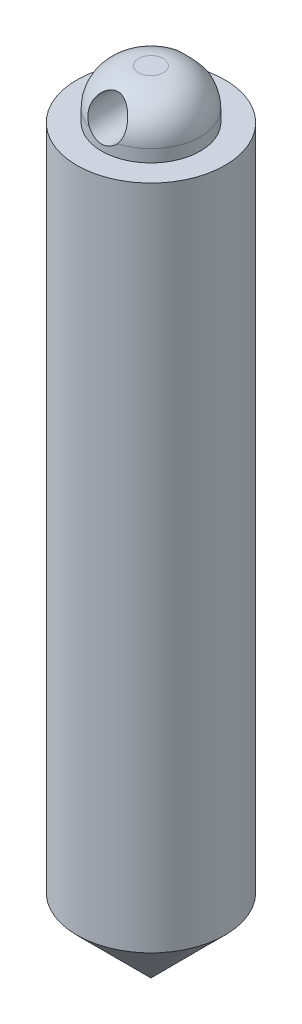
ISO-10303-21;
HEADER;
FILE_DESCRIPTION(('STEP AP214'),'2;1');
FILE_NAME('part.step','',(''),(''),'','','');
FILE_SCHEMA(('AUTOMOTIVE_DESIGN { 1 0 10303 214 1 1 1 1 }'));
ENDSEC;
DATA;
#1=APPLICATION_CONTEXT('core data for automotive mechanical design processes');
#2=APPLICATION_PROTOCOL_DEFINITION('international standard','automotive_design',2000,#1);
#3=PRODUCT_CONTEXT('',#1,'mechanical');
#4=PRODUCT('Part','Part','',(#3));
#5=PRODUCT_RELATED_PRODUCT_CATEGORY('part','',(#4));
#6=PRODUCT_DEFINITION_FORMATION('','',#4);
#7=PRODUCT_DEFINITION_CONTEXT('part definition',#1,'design');
#8=PRODUCT_DEFINITION('design','',#6,#7);
#9=PRODUCT_DEFINITION_SHAPE('','',#8);
#10=(LENGTH_UNIT() NAMED_UNIT(*) SI_UNIT(.MILLI.,.METRE.));
#11=(NAMED_UNIT(*) PLANE_ANGLE_UNIT() SI_UNIT($,.RADIAN.));
#12=(NAMED_UNIT(*) SI_UNIT($,.STERADIAN.) SOLID_ANGLE_UNIT());
#13=UNCERTAINTY_MEASURE_WITH_UNIT(LENGTH_MEASURE(1.E-05),#10,'distance_accuracy_value','');
#14=(GEOMETRIC_REPRESENTATION_CONTEXT(3) GLOBAL_UNCERTAINTY_ASSIGNED_CONTEXT((#13)) GLOBAL_UNIT_ASSIGNED_CONTEXT((#10,
#11,#12)) REPRESENTATION_CONTEXT('',''));
#15=CARTESIAN_POINT('',(0.,0.,0.));
#16=DIRECTION('',(0.,0.,1.));
#17=DIRECTION('',(1.,0.,0.));
#18=AXIS2_PLACEMENT_3D('',#15,#16,#17);
#19=CARTESIAN_POINT('',(0.,35.,0.));
#20=DIRECTION('',(0.,-1.,0.));
#21=DIRECTION('',(0.,0.,-1.));
#22=AXIS2_PLACEMENT_3D('',#19,#20,#21);
#23=CYLINDRICAL_SURFACE('',#22,28.6427964339937);
#24=CARTESIAN_POINT('',(0.,35.,0.));
#25=DIRECTION('',(0.,-1.,0.));
#26=DIRECTION('',(0.,0.,-1.));
#27=AXIS2_PLACEMENT_3D('',#24,#25,#26);
#28=CIRCLE('',#27,28.6427964339937);
#29=CARTESIAN_POINT('',(0.,35.,-28.6427964339937));
#30=VERTEX_POINT('',#29);
#31=EDGE_CURVE('E60',#30,#30,#28,.T.);
#32=ORIENTED_EDGE('',*,*,#31,.F.);
#33=EDGE_LOOP('',(#32));
#34=FACE_BOUND('',#33,.T.);
#35=CARTESIAN_POINT('',(0.,50.,0.));
#36=DIRECTION('',(0.,-1.,0.));
#37=DIRECTION('',(0.,0.,-1.));
#38=AXIS2_PLACEMENT_3D('',#35,#36,#37);
#39=CIRCLE('',#38,28.6427964339937);
#40=CARTESIAN_POINT('',(0.,50.,-28.6427964339937));
#41=VERTEX_POINT('',#40);
#42=EDGE_CURVE('E11',#41,#41,#39,.T.);
#43=ORIENTED_EDGE('',*,*,#42,.T.);
#44=EDGE_LOOP('',(#43));
#45=FACE_BOUND('',#44,.T.);
#46=ADVANCED_FACE('F46',(#34,#45),#23,.T.);
#47=CARTESIAN_POINT('',(-28.6427964339937,50.,0.));
#48=DIRECTION('',(0.,-1.,0.));
#49=DIRECTION('',(0.,0.,-1.));
#50=AXIS2_PLACEMENT_3D('',#47,#48,#49);
#51=PLANE('',#50);
#52=ORIENTED_EDGE('',*,*,#42,.F.);
#53=EDGE_LOOP('',(#52));
#54=FACE_BOUND('',#53,.T.);
#55=CARTESIAN_POINT('',(0.,50.,0.));
#56=DIRECTION('',(0.,-1.,0.));
#57=DIRECTION('',(0.,0.,-1.));
#58=AXIS2_PLACEMENT_3D('',#55,#56,#57);
#59=CIRCLE('',#58,18.6427964339937);
#60=CARTESIAN_POINT('',(0.,50.,-18.6427964339937));
#61=VERTEX_POINT('',#60);
#62=EDGE_CURVE('E52',#61,#61,#59,.T.);
#63=ORIENTED_EDGE('',*,*,#62,.T.);
#64=EDGE_LOOP('',(#63));
#65=FACE_BOUND('',#64,.T.);
#66=ADVANCED_FACE('F69',(#54,#65),#51,.F.);
#67=CARTESIAN_POINT('',(0.,35.,0.));
#68=DIRECTION('',(0.,-1.,0.));
#69=DIRECTION('',(0.,0.,-1.));
#70=AXIS2_PLACEMENT_3D('',#67,#68,#69);
#71=CYLINDRICAL_SURFACE('',#70,18.6427964339937);
#72=ORIENTED_EDGE('',*,*,#62,.F.);
#73=EDGE_LOOP('',(#72));
#74=FACE_BOUND('',#73,.T.);
#75=CARTESIAN_POINT('',(0.,35.,0.));
#76=DIRECTION('',(0.,-1.,0.));
#77=DIRECTION('',(0.,0.,-1.));
#78=AXIS2_PLACEMENT_3D('',#75,#76,#77);
#79=CIRCLE('',#78,18.6427964339937);
#80=CARTESIAN_POINT('',(0.,35.,-18.6427964339937));
#81=VERTEX_POINT('',#80);
#82=EDGE_CURVE('E56',#81,#81,#79,.T.);
#83=ORIENTED_EDGE('',*,*,#82,.T.);
#84=EDGE_LOOP('',(#83));
#85=FACE_BOUND('',#84,.T.);
#86=ADVANCED_FACE('F73',(#74,#85),#71,.F.);
#87=CARTESIAN_POINT('',(-28.6427964339937,35.,0.));
#88=DIRECTION('',(0.,1.,0.));
#89=DIRECTION('',(0.,0.,1.));
#90=AXIS2_PLACEMENT_3D('',#87,#88,#89);
#91=PLANE('',#90);
#92=ORIENTED_EDGE('',*,*,#82,.F.);
#93=EDGE_LOOP('',(#92));
#94=FACE_BOUND('',#93,.T.);
#95=ORIENTED_EDGE('',*,*,#31,.T.);
#96=EDGE_LOOP('',(#95));
#97=FACE_BOUND('',#96,.T.);
#98=ADVANCED_FACE('F66',(#94,#97),#91,.F.);
#99=CLOSED_SHELL('',(#46,#66,#86,#98));
#100=MANIFOLD_SOLID_BREP('B2',#99);
#101=CARTESIAN_POINT('',(0.,270.,0.));
#102=DIRECTION('',(0.,-1.,0.));
#103=DIRECTION('',(0.,0.,-1.));
#104=AXIS2_PLACEMENT_3D('',#101,#102,#103);
#105=CYLINDRICAL_SURFACE('',#104,30.);
#106=CARTESIAN_POINT('',(0.,270.,0.));
#107=DIRECTION('',(0.,1.,0.));
#108=DIRECTION('',(0.,0.,1.));
#109=AXIS2_PLACEMENT_3D('',#106,#107,#108);
#110=CIRCLE('',#109,30.);
#111=CARTESIAN_POINT('',(0.,270.,30.));
#112=VERTEX_POINT('',#111);
#113=EDGE_CURVE('E215',#112,#112,#110,.T.);
#114=ORIENTED_EDGE('',*,*,#113,.F.);
#115=EDGE_LOOP('',(#114));
#116=FACE_BOUND('',#115,.T.);
#117=CARTESIAN_POINT('',(0.,0.,0.));
#118=DIRECTION('',(0.,1.,0.));
#119=DIRECTION('',(0.,0.,1.));
#120=AXIS2_PLACEMENT_3D('',#117,#118,#119);
#121=CIRCLE('',#120,30.);
#122=CARTESIAN_POINT('',(0.,0.,30.));
#123=VERTEX_POINT('',#122);
#124=EDGE_CURVE('E218',#123,#123,#121,.T.);
#125=ORIENTED_EDGE('',*,*,#124,.T.);
#126=EDGE_LOOP('',(#125));
#127=FACE_BOUND('',#126,.T.);
#128=ADVANCED_FACE('F108',(#116,#127),#105,.T.);
#129=CARTESIAN_POINT('',(0.,270.,0.));
#130=DIRECTION('',(0.,1.,0.));
#131=DIRECTION('',(0.,0.,1.));
#132=AXIS2_PLACEMENT_3D('',#129,#130,#131);
#133=PLANE('',#132);
#134=CARTESIAN_POINT('',(0.,270.,0.));
#135=DIRECTION('',(0.,1.,0.));
#136=DIRECTION('',(0.,0.,1.));
#137=AXIS2_PLACEMENT_3D('',#134,#135,#136);
#138=CIRCLE('',#137,20.);
#139=CARTESIAN_POINT('',(0.,270.,20.));
#140=VERTEX_POINT('',#139);
#141=EDGE_CURVE('E159',#140,#140,#138,.T.);
#142=ORIENTED_EDGE('',*,*,#141,.F.);
#143=EDGE_LOOP('',(#142));
#144=FACE_BOUND('',#143,.T.);
#145=ORIENTED_EDGE('',*,*,#113,.T.);
#146=EDGE_LOOP('',(#145));
#147=FACE_BOUND('',#146,.T.);
#148=ADVANCED_FACE('F191',(#144,#147),#133,.T.);
#149=CARTESIAN_POINT('',(0.,-30.,0.));
#150=DIRECTION('',(0.,1.,0.));
#151=DIRECTION('',(0.,0.,1.));
#152=AXIS2_PLACEMENT_3D('',#149,#150,#151);
#153=CONICAL_SURFACE('',#152,0.,0.785398163397448);
#154=ORIENTED_EDGE('',*,*,#124,.F.);
#155=EDGE_LOOP('',(#154));
#156=FACE_BOUND('',#155,.T.);
#157=CARTESIAN_POINT('',(0.,-30.,0.));
#158=VERTEX_POINT('',#157);
#159=VERTEX_LOOP('',#158);
#160=FACE_BOUND('',#159,.T.);
#161=ADVANCED_FACE('F187',(#156,#160),#153,.T.);
#162=CARTESIAN_POINT('',(0.,290.,0.));
#163=DIRECTION('',(0.,-1.,0.));
#164=DIRECTION('',(0.,0.,-1.));
#165=AXIS2_PLACEMENT_3D('',#162,#163,#164);
#166=CYLINDRICAL_SURFACE('',#165,20.);
#167=CARTESIAN_POINT('',(0.,275.,0.));
#168=DIRECTION('',(0.,1.,0.));
#169=DIRECTION('',(0.,0.,1.));
#170=AXIS2_PLACEMENT_3D('',#167,#168,#169);
#171=CIRCLE('',#170,20.);
#172=CARTESIAN_POINT('',(5.59016994374949,275.,-19.2028643696715));
#173=VERTEX_POINT('',#172);
#174=CARTESIAN_POINT('',(5.59016994374949,275.,19.2028643696715));
#175=VERTEX_POINT('',#174);
#176=EDGE_CURVE('E153',#173,#175,#171,.F.);
#177=ORIENTED_EDGE('',*,*,#176,.T.);
#178=CARTESIAN_POINT('',(5.59016994374949,275.,19.2028643696715));
#179=CARTESIAN_POINT('',(5.45032258890132,274.843631157481,19.243583425374));
#180=CARTESIAN_POINT('',(5.30392897479388,274.69317496289,19.2845359120735));
#181=CARTESIAN_POINT('',(4.99894296702762,274.404952274119,19.3658305769389));
#182=CARTESIAN_POINT('',(4.8403487561464,274.267187677036,19.4061726631133));
#183=CARTESIAN_POINT('',(4.51157094539349,274.004999308431,19.485235103552));
#184=CARTESIAN_POINT('',(4.34136492225987,273.880602616046,19.5239520726932));
#185=CARTESIAN_POINT('',(3.9906696200309,273.646338401218,19.5986398709426));
#186=CARTESIAN_POINT('',(3.81018092001957,273.536470061745,19.6346108544286));
#187=CARTESIAN_POINT('',(3.43970171290755,273.331919148331,19.7028929034449));
#188=CARTESIAN_POINT('',(3.24969516775314,273.237263420374,19.7351974699021));
#189=CARTESIAN_POINT('',(2.86172949951137,273.064178679726,19.7951767825535));
#190=CARTESIAN_POINT('',(2.66377080840725,272.98574878702,19.8228517798185));
#191=CARTESIAN_POINT('',(2.26151625113917,272.845922184914,19.8727594064096));
#192=CARTESIAN_POINT('',(2.05722807183664,272.784505650629,19.8949983665139));
#193=CARTESIAN_POINT('',(1.64362602624192,272.679206001055,19.9334296585282));
#194=CARTESIAN_POINT('',(1.43431241452904,272.635321999576,19.949622296049));
#195=CARTESIAN_POINT('',(1.02105443234143,272.567000755216,19.9749472048522));
#196=CARTESIAN_POINT('',(0.817246801690964,272.541833273531,19.9843441514046));
#197=CARTESIAN_POINT('',(0.408062954148355,272.508296626618,19.996884143916));
#198=CARTESIAN_POINT('',(0.202686776257213,272.499927045077,20.0000273448657));
#199=CARTESIAN_POINT('',(-0.208066873170677,272.500073919764,19.9999722933196));
#200=CARTESIAN_POINT('',(-0.413444344336916,272.508591148379,19.9967737507582));
#201=CARTESIAN_POINT('',(-0.822613097652393,272.542423534879,19.9841237129078));
#202=CARTESIAN_POINT('',(-1.0264044073933,272.5677383999,19.9746723266355));
#203=CARTESIAN_POINT('',(-1.42340402614205,272.633663849929,19.9502383642098));
#204=CARTESIAN_POINT('',(-1.61672550991742,272.673676118245,19.9354725532663));
#205=CARTESIAN_POINT('',(-1.99923967619587,272.768686855877,19.9007521144654));
#206=CARTESIAN_POINT('',(-2.18843095922711,272.823690322208,19.8807957565453));
#207=CARTESIAN_POINT('',(-2.56146696263992,272.948222324256,19.8361838584658));
#208=CARTESIAN_POINT('',(-2.74530984192054,273.01775579584,19.8115267216942));
#209=CARTESIAN_POINT('',(-3.10647914654353,273.170779197329,19.7581152483328));
#210=CARTESIAN_POINT('',(-3.28380522781653,273.254269862848,19.7293606958003));
#211=CARTESIAN_POINT('',(-3.63651669670947,273.437492682309,19.6674561392738));
#212=CARTESIAN_POINT('',(-3.8116557314352,273.537661248795,19.6341944148924));
#213=CARTESIAN_POINT('',(-4.15285523414972,273.751455025764,19.5648689040141));
#214=CARTESIAN_POINT('',(-4.31891826671761,273.865076405891,19.5288059161088));
#215=CARTESIAN_POINT('',(-4.64085506275789,274.104858674597,19.454811951969));
#216=CARTESIAN_POINT('',(-4.7967445087303,274.230999469758,19.4168840167766));
#217=CARTESIAN_POINT('',(-5.09773973798763,274.495173251621,19.3400402871739));
#218=CARTESIAN_POINT('',(-5.24284994848067,274.633201305168,19.3011249072328));
#219=CARTESIAN_POINT('',(-5.45302575746426,274.849770015048,19.2423994447944));
#220=CARTESIAN_POINT('',(-5.52237082059306,274.924195410621,19.2226023893761));
#221=CARTESIAN_POINT('',(-5.59016994374949,275.,19.2028643696715));
#222=B_SPLINE_CURVE_WITH_KNOTS('',3,(#178,#179,#180,#181,#182,#183,#184,#185,#186,#187,#188,
#189,#190,#191,#192,#193,#194,#195,#196,#197,#198,#199,#200,#201,#202,#203,#204,#205,#206,#207,
#208,#209,#210,#211,#212,#213,#214,#215,#216,#217,#218,#219,#220,#221),.UNSPECIFIED.,.F.,.F.,(4,
2,2,2,2,2,2,2,2,2,2,2,2,2,2,2,2,2,2,2,2,4),(0.,0.640915441843885,1.28192653059167,
1.92421255442747,2.56646244267075,3.20983356320771,3.85316978112954,4.49575316503481,
5.13830406522722,5.75423879317786,6.37015825581391,6.9861058906883,7.60204278694844,
8.19527186464552,8.78869892565237,9.38232790350331,9.97598817846886,10.5887644824473,
11.2013667311922,11.8130011942312,12.4243830438944,12.7351939500205),.UNSPECIFIED.);
#223=CARTESIAN_POINT('',(-5.59016994374949,275.,19.2028643696715));
#224=VERTEX_POINT('',#223);
#225=EDGE_CURVE('E128',#175,#224,#222,.T.);
#226=ORIENTED_EDGE('',*,*,#225,.T.);
#227=CARTESIAN_POINT('',(-5.59016994374949,275.,-19.2028643696715));
#228=VERTEX_POINT('',#227);
#229=EDGE_CURVE('E148',#224,#228,#171,.F.);
#230=ORIENTED_EDGE('',*,*,#229,.T.);
#231=CARTESIAN_POINT('',(-5.59016994374949,275.,-19.2028643696715));
#232=CARTESIAN_POINT('',(-5.45032258890132,274.843631157481,-19.243583425374));
#233=CARTESIAN_POINT('',(-5.30392897479388,274.69317496289,-19.2845359120735));
#234=CARTESIAN_POINT('',(-4.99894296702762,274.404952274119,-19.3658305769389));
#235=CARTESIAN_POINT('',(-4.8403487561464,274.267187677036,-19.4061726631133));
#236=CARTESIAN_POINT('',(-4.51157094539349,274.004999308431,-19.485235103552));
#237=CARTESIAN_POINT('',(-4.34136492225987,273.880602616046,-19.5239520726932));
#238=CARTESIAN_POINT('',(-3.9906696200309,273.646338401218,-19.5986398709426));
#239=CARTESIAN_POINT('',(-3.81018092001957,273.536470061745,-19.6346108544286));
#240=CARTESIAN_POINT('',(-3.43970171290755,273.331919148331,-19.7028929034449));
#241=CARTESIAN_POINT('',(-3.24969516775314,273.237263420374,-19.7351974699021));
#242=CARTESIAN_POINT('',(-2.86172949951137,273.064178679726,-19.7951767825535));
#243=CARTESIAN_POINT('',(-2.66377080840725,272.98574878702,-19.8228517798185));
#244=CARTESIAN_POINT('',(-2.26151625113917,272.845922184914,-19.8727594064096));
#245=CARTESIAN_POINT('',(-2.05722807183664,272.784505650629,-19.8949983665139));
#246=CARTESIAN_POINT('',(-1.64362602624192,272.679206001055,-19.9334296585282));
#247=CARTESIAN_POINT('',(-1.43431241452904,272.635321999576,-19.949622296049));
#248=CARTESIAN_POINT('',(-1.02105443234143,272.567000755216,-19.9749472048522));
#249=CARTESIAN_POINT('',(-0.817246801690964,272.541833273531,-19.9843441514046));
#250=CARTESIAN_POINT('',(-0.408062954148355,272.508296626618,-19.996884143916));
#251=CARTESIAN_POINT('',(-0.202686776257213,272.499927045077,-20.0000273448657));
#252=CARTESIAN_POINT('',(0.208066873170677,272.500073919764,-19.9999722933196));
#253=CARTESIAN_POINT('',(0.413444344336916,272.508591148379,-19.9967737507582));
#254=CARTESIAN_POINT('',(0.822613097652393,272.542423534879,-19.9841237129078));
#255=CARTESIAN_POINT('',(1.0264044073933,272.5677383999,-19.9746723266355));
#256=CARTESIAN_POINT('',(1.42340402614205,272.633663849929,-19.9502383642098));
#257=CARTESIAN_POINT('',(1.61672550991742,272.673676118245,-19.9354725532663));
#258=CARTESIAN_POINT('',(1.99923967619587,272.768686855877,-19.9007521144654));
#259=CARTESIAN_POINT('',(2.18843095922711,272.823690322208,-19.8807957565453));
#260=CARTESIAN_POINT('',(2.56146696263992,272.948222324256,-19.8361838584658));
#261=CARTESIAN_POINT('',(2.74530984192054,273.01775579584,-19.8115267216942));
#262=CARTESIAN_POINT('',(3.10647914654353,273.170779197329,-19.7581152483328));
#263=CARTESIAN_POINT('',(3.28380522781653,273.254269862848,-19.7293606958003));
#264=CARTESIAN_POINT('',(3.63651669670947,273.437492682309,-19.6674561392738));
#265=CARTESIAN_POINT('',(3.8116557314352,273.537661248795,-19.6341944148924));
#266=CARTESIAN_POINT('',(4.15285523414972,273.751455025764,-19.5648689040141));
#267=CARTESIAN_POINT('',(4.31891826671761,273.865076405891,-19.5288059161088));
#268=CARTESIAN_POINT('',(4.64085506275789,274.104858674597,-19.454811951969));
#269=CARTESIAN_POINT('',(4.7967445087303,274.230999469758,-19.4168840167766));
#270=CARTESIAN_POINT('',(5.09773973798763,274.495173251621,-19.3400402871739));
#271=CARTESIAN_POINT('',(5.24284994848067,274.633201305168,-19.3011249072328));
#272=CARTESIAN_POINT('',(5.45302575746426,274.849770015048,-19.2423994447944));
#273=CARTESIAN_POINT('',(5.52237082059306,274.924195410621,-19.2226023893761));
#274=CARTESIAN_POINT('',(5.59016994374949,275.,-19.2028643696715));
#275=B_SPLINE_CURVE_WITH_KNOTS('',3,(#231,#232,#233,#234,#235,#236,#237,#238,#239,#240,#241,
#242,#243,#244,#245,#246,#247,#248,#249,#250,#251,#252,#253,#254,#255,#256,#257,#258,#259,#260,
#261,#262,#263,#264,#265,#266,#267,#268,#269,#270,#271,#272,#273,#274),.UNSPECIFIED.,.F.,.F.,(4,
2,2,2,2,2,2,2,2,2,2,2,2,2,2,2,2,2,2,2,2,4),(0.,0.640915441843885,1.28192653059167,
1.92421255442747,2.56646244267075,3.20983356320771,3.85316978112954,4.49575316503481,
5.13830406522722,5.75423879317786,6.37015825581391,6.9861058906883,7.60204278694844,
8.19527186464552,8.78869892565237,9.38232790350331,9.97598817846886,10.5887644824473,
11.2013667311922,11.8130011942312,12.4243830438944,12.7351939500205),.UNSPECIFIED.);
#276=EDGE_CURVE('E135',#228,#173,#275,.T.);
#277=ORIENTED_EDGE('',*,*,#276,.T.);
#278=EDGE_LOOP('',(#177,#226,#230,#277));
#279=FACE_BOUND('',#278,.T.);
#280=ORIENTED_EDGE('',*,*,#141,.T.);
#281=EDGE_LOOP('',(#280));
#282=FACE_BOUND('',#281,.T.);
#283=ADVANCED_FACE('F151',(#279,#282),#166,.T.);
#284=CARTESIAN_POINT('',(0.,290.,0.));
#285=DIRECTION('',(0.,1.,0.));
#286=DIRECTION('',(0.,0.,1.));
#287=AXIS2_PLACEMENT_3D('',#284,#285,#286);
#288=PLANE('',#287);
#289=CARTESIAN_POINT('',(0.,290.,0.));
#290=DIRECTION('',(0.,1.,0.));
#291=DIRECTION('',(0.,0.,1.));
#292=AXIS2_PLACEMENT_3D('',#289,#290,#291);
#293=CIRCLE('',#292,5.);
#294=CARTESIAN_POINT('',(0.,290.,5.));
#295=VERTEX_POINT('',#294);
#296=EDGE_CURVE('E156',#295,#295,#293,.T.);
#297=ORIENTED_EDGE('',*,*,#296,.T.);
#298=EDGE_LOOP('',(#297));
#299=FACE_BOUND('',#298,.T.);
#300=ADVANCED_FACE('F169',(#299),#288,.T.);
#301=CARTESIAN_POINT('',(0.,275.,0.));
#302=DIRECTION('',(0.,1.,0.));
#303=DIRECTION('',(0.,0.,1.));
#304=AXIS2_PLACEMENT_3D('',#301,#302,#303);
#305=DEGENERATE_TOROIDAL_SURFACE('',#304,5.,15.,.T.);
#306=CARTESIAN_POINT('',(5.5899910518712,274.9998,19.2029164448181));
#307=CARTESIAN_POINT('',(5.73323126234259,275.159892148711,19.1612363747593));
#308=CARTESIAN_POINT('',(5.86923529297125,275.325823107997,19.1172258684896));
#309=CARTESIAN_POINT('',(6.12599048636035,275.667814775626,19.0245890694058));
#310=CARTESIAN_POINT('',(6.24674573606907,275.843872751254,18.9759640195185));
#311=CARTESIAN_POINT('',(6.47198903558058,276.204159821471,18.8742614749358));
#312=CARTESIAN_POINT('',(6.57652110504104,276.388364997986,18.82119665212));
#313=CARTESIAN_POINT('',(6.7691926279062,276.763867120593,18.710576228429));
#314=CARTESIAN_POINT('',(6.85733143188552,276.95516434728,18.653020449771));
#315=CARTESIAN_POINT('',(7.01677142811016,277.34314556542,18.5335816796583));
#316=CARTESIAN_POINT('',(7.08808582027573,277.539825197879,18.4717021302441));
#317=CARTESIAN_POINT('',(7.21377459524204,277.937256644392,18.3437042251708));
#318=CARTESIAN_POINT('',(7.26814277350455,278.138009921348,18.2775843276462));
#319=CARTESIAN_POINT('',(7.35984437100376,278.542051509692,18.1413018946036));
#320=CARTESIAN_POINT('',(7.39717493688677,278.74534023985,18.0711386841509));
#321=CARTESIAN_POINT('',(7.45485969336572,279.152977733174,17.9269969043058));
#322=CARTESIAN_POINT('',(7.47521268585523,279.357326570128,17.8530180660357));
#323=CARTESIAN_POINT('',(7.49958400686253,279.773464245075,17.6986137067929));
#324=CARTESIAN_POINT('',(7.50295057316906,279.985239972791,17.6180499616587));
#325=CARTESIAN_POINT('',(7.49192139353563,280.40695220278,17.4534039543866));
#326=CARTESIAN_POINT('',(7.47752490387222,280.616888627671,17.3693215450678));
#327=CARTESIAN_POINT('',(7.43139827197436,281.033568806934,17.1979806528997));
#328=CARTESIAN_POINT('',(7.39966539568628,281.240312052431,17.1107216711122));
#329=CARTESIAN_POINT('',(7.31937562959444,281.649295411721,16.9334280401406));
#330=CARTESIAN_POINT('',(7.27081778025663,281.851535267982,16.8433932329172));
#331=CARTESIAN_POINT('',(7.15383937033375,282.263004750236,16.6551770655722));
#332=CARTESIAN_POINT('',(7.0843521405489,282.471861126212,16.5568417272901));
#333=CARTESIAN_POINT('',(6.92772008783806,282.881813487248,16.3580965336529));
#334=CARTESIAN_POINT('',(6.84057499869593,283.082909355253,16.2576866470416));
#335=CARTESIAN_POINT('',(6.64932942460743,283.4762429277,16.055385687654));
#336=CARTESIAN_POINT('',(6.54522028437047,283.668476045672,15.9534938830797));
#337=CARTESIAN_POINT('',(6.32082786422391,284.042866576648,15.7490177429274));
#338=CARTESIAN_POINT('',(6.20054436521243,284.225023853115,15.6464333979859));
#339=CARTESIAN_POINT('',(5.93733367772149,284.588151883521,15.4356677478707));
#340=CARTESIAN_POINT('',(5.79351454142656,284.768482326908,15.3274954333559));
#341=CARTESIAN_POINT('',(5.48948828647305,285.115537462176,15.1125626892875));
#342=CARTESIAN_POINT('',(5.32928687279933,285.282266854388,15.0058017827506));
#343=CARTESIAN_POINT('',(4.99315702401285,285.60107601442,14.7950941168407));
#344=CARTESIAN_POINT('',(4.81722638727528,285.753153725231,14.6911477540816));
#345=CARTESIAN_POINT('',(4.45034061851111,286.041429853801,14.4879031580909));
#346=CARTESIAN_POINT('',(4.25938934016181,286.177632322381,14.3886037430039));
#347=CARTESIAN_POINT('',(3.90669459441992,286.40480612131,14.2180017652286));
#348=CARTESIAN_POINT('',(3.74776176196413,286.499137627098,14.1453443582923));
#349=CARTESIAN_POINT('',(3.42148643076785,286.676669003098,14.0055543714588));
#350=CARTESIAN_POINT('',(3.25414581303558,286.75987134803,13.9384205645963));
#351=CARTESIAN_POINT('',(2.91164840914475,286.91430071646,13.8112694666905));
#352=CARTESIAN_POINT('',(2.73650038208945,286.985540752818,13.7512444637677));
#353=CARTESIAN_POINT('',(2.37892422394689,287.11525465527,13.6400026312379));
#354=CARTESIAN_POINT('',(2.1965010946684,287.173737119447,13.588779874248));
#355=CARTESIAN_POINT('',(1.8599961139318,287.267389206228,13.5055692499266));
#356=CARTESIAN_POINT('',(1.70700311140031,287.304873596789,13.4717756512419));
#357=CARTESIAN_POINT('',(1.39752071629453,287.370341284731,13.412207558807));
#358=CARTESIAN_POINT('',(1.24103310842922,287.39832931879,13.3864290677477));
#359=CARTESIAN_POINT('',(0.925538321307102,287.444378259854,13.3437548149907));
#360=CARTESIAN_POINT('',(0.766533501470653,287.46244795529,13.3268511900415));
#361=CARTESIAN_POINT('',(0.446962271584686,287.488385734134,13.3025212366795));
#362=CARTESIAN_POINT('',(0.28639585151592,287.496253752044,13.2950949691138));
#363=CARTESIAN_POINT('',(-0.0354218949533897,287.501646507475,13.2900094074299));
#364=CARTESIAN_POINT('',(-0.196673950908669,287.499148406198,13.2923716795593));
#365=CARTESIAN_POINT('',(-0.518238804590748,287.483805232922,13.3068162934163));
#366=CARTESIAN_POINT('',(-0.678551612687076,287.470960275371,13.3188985276286));
#367=CARTESIAN_POINT('',(-0.997204292075871,287.43514056199,13.352328940925));
#368=CARTESIAN_POINT('',(-1.15554221280904,287.412156498648,13.373685633509));
#369=CARTESIAN_POINT('',(-1.46910614292133,287.356432500121,13.4249053825724));
#370=CARTESIAN_POINT('',(-1.62433145343185,287.32369039959,13.4547703270014));
#371=CARTESIAN_POINT('',(-1.96311969558179,287.241037352367,13.5291539310931));
#372=CARTESIAN_POINT('',(-2.14576961099913,287.188963173015,13.5754338753981));
#373=CARTESIAN_POINT('',(-2.50426157503796,287.072075007219,13.6772902600497));
#374=CARTESIAN_POINT('',(-2.68010222079431,287.007258412085,13.7328686036622));
#375=CARTESIAN_POINT('',(-3.02450524739327,286.865645166546,13.8516645579541));
#376=CARTESIAN_POINT('',(-3.19305707144994,286.788831836843,13.9148927764059));
#377=CARTESIAN_POINT('',(-3.52216927777103,286.624062522088,14.0473702313754));
#378=CARTESIAN_POINT('',(-3.68272792974474,286.536104138938,14.1166207627147));
#379=CARTESIAN_POINT('',(-4.03441323775259,286.326546558665,14.277599989103));
#380=CARTESIAN_POINT('',(-4.22320494246385,286.202022577196,14.3706341892728));
#381=CARTESIAN_POINT('',(-4.58717731553578,285.937877112476,14.5617806271039));
#382=CARTESIAN_POINT('',(-4.76235501795233,285.79825235513,14.6598939635911));
#383=CARTESIAN_POINT('',(-5.09848228345904,285.505016540108,14.8594166833215));
#384=CARTESIAN_POINT('',(-5.25943401440066,285.351407620704,14.9608255611352));
#385=CARTESIAN_POINT('',(-5.56658172732411,285.031144241312,15.1655683382196));
#386=CARTESIAN_POINT('',(-5.71277216723381,284.864484922989,15.2689029433768));
#387=CARTESIAN_POINT('',(-5.99058218697277,284.518025348397,15.4769870055221));
#388=CARTESIAN_POINT('',(-6.12209802830027,284.338144825494,15.5817413024317));
#389=CARTESIAN_POINT('',(-6.36873569655086,283.967219276465,15.7910328777734));
#390=CARTESIAN_POINT('',(-6.48385043369709,283.776169472167,15.8955700432201));
#391=CARTESIAN_POINT('',(-6.69682976533509,283.384114705578,16.1035318905989));
#392=CARTESIAN_POINT('',(-6.79469502460167,283.183110127314,16.2069566152589));
#393=CARTESIAN_POINT('',(-6.97233770656701,282.772459517107,16.4119164374651));
#394=CARTESIAN_POINT('',(-7.05212310076106,282.562817341894,16.5134523496006));
#395=CARTESIAN_POINT('',(-7.19570564033129,282.127540595344,16.7180794314745));
#396=CARTESIAN_POINT('',(-7.25872924033992,281.901601993739,16.8210684809721));
#397=CARTESIAN_POINT('',(-7.36353115576114,281.443469144289,17.0236636289356));
#398=CARTESIAN_POINT('',(-7.40531761533768,281.211277330493,17.1232710105308));
#399=CARTESIAN_POINT('',(-7.46691958991303,280.742324609219,17.3185801109433));
#400=CARTESIAN_POINT('',(-7.48673167938787,280.505562995219,17.4142812185833));
#401=CARTESIAN_POINT('',(-7.503722698192,280.029486119376,17.601235763373));
#402=CARTESIAN_POINT('',(-7.5009031998051,279.790171036084,17.6924895090511));
#403=CARTESIAN_POINT('',(-7.47286273484225,279.322994685817,17.8656822152771));
#404=CARTESIAN_POINT('',(-7.44876004881302,279.095154188271,17.9478586930191));
#405=CARTESIAN_POINT('',(-7.37942676974728,278.641026985909,18.1074282532584));
#406=CARTESIAN_POINT('',(-7.33419826816841,278.414740129532,18.1848218084067));
#407=CARTESIAN_POINT('',(-7.22259845909436,277.965913373104,18.3344740432355));
#408=CARTESIAN_POINT('',(-7.15624383626905,277.743370661592,18.4067367202085));
#409=CARTESIAN_POINT('',(-7.00253728941257,277.303961669127,18.5459430201234));
#410=CARTESIAN_POINT('',(-6.91518906566623,277.087094395295,18.6128875776614));
#411=CARTESIAN_POINT('',(-6.74020219925403,276.705438372701,18.727927089026));
#412=CARTESIAN_POINT('',(-6.65639436216188,276.539190852128,18.7770485902061));
#413=CARTESIAN_POINT('',(-6.47617402539521,276.212661277619,18.8717680595169));
#414=CARTESIAN_POINT('',(-6.37976411926257,276.052378004918,18.9173667495885));
#415=CARTESIAN_POINT('',(-6.17461758697796,275.73863302093,19.0050485861038));
#416=CARTESIAN_POINT('',(-6.06586781563558,275.585178831229,19.047127899039));
#417=CARTESIAN_POINT('',(-5.8366116579762,275.286240642069,19.1277124175977));
#418=CARTESIAN_POINT('',(-5.71610126928496,275.140759382446,19.1662163977029));
#419=CARTESIAN_POINT('',(-5.58999105187121,274.9998,19.2029164448181));
#420=B_SPLINE_CURVE_WITH_KNOTS('',3,(#306,#307,#308,#309,#310,#311,#312,#313,#314,#315,#316,
#317,#318,#319,#320,#321,#322,#323,#324,#325,#326,#327,#328,#329,#330,#331,#332,#333,#334,#335,
#336,#337,#338,#339,#340,#341,#342,#343,#344,#345,#346,#347,#348,#349,#350,#351,#352,#353,#354,
#355,#356,#357,#358,#359,#360,#361,#362,#363,#364,#365,#366,#367,#368,#369,#370,#371,#372,#373,
#374,#375,#376,#377,#378,#379,#380,#381,#382,#383,#384,#385,#386,#387,#388,#389,#390,#391,#392,
#393,#394,#395,#396,#397,#398,#399,#400,#401,#402,#403,#404,#405,#406,#407,#408,#409,#410,#411,
#412,#413,#414,#415,#416,#417,#418,#419),.UNSPECIFIED.,.F.,.F.,(4,2,2,2,2,2,2,2,2,2,2,2,2,2,2,2,
2,2,2,2,2,2,2,2,2,2,2,2,2,2,2,2,2,2,2,2,2,2,2,2,2,2,2,2,2,2,2,2,2,2,2,2,2,2,2,2,4),(0.,
0.656237983716653,1.31229970882287,1.96654893513271,2.62082407425461,3.27458416914371,
3.92858334561816,4.58269200966502,5.23684683021999,5.91592008157398,6.59502176608957,
7.27423058000063,7.95347813580333,8.67591667100855,9.3983660987632,10.121185290945,
10.8440142756015,11.6074093208058,12.3705394198755,13.1337765022588,13.8968184041621,
14.4920703084791,15.0871896296156,15.681657313041,16.2757231030977,16.7585570464858,
17.2411498023655,17.723314249877,18.2054817930056,18.6887122186109,19.1719372991417,
19.6556068974575,20.1393839039753,20.7249961423059,21.3107283951191,21.8972823740539,
22.4839627777315,23.2166266170972,23.9494496296063,24.6821607762695,25.4151460016606,
26.1530223242751,26.8912166504037,27.6293825211586,28.3672222951987,29.1347851725347,
29.9020534770807,30.6694413721636,31.4367759549854,32.1660429170659,32.8952376969495,
33.623858006968,34.3523499860715,34.9294874767986,35.5065063774393,36.0841458295502,
36.6619825540814),.UNSPECIFIED.);
#421=EDGE_CURVE('E44',#175,#224,#420,.T.);
#422=ORIENTED_EDGE('',*,*,#421,.F.);
#423=ORIENTED_EDGE('',*,*,#176,.F.);
#424=CARTESIAN_POINT('',(-5.5899910518712,274.9998,-19.2029164448181));
#425=CARTESIAN_POINT('',(-5.73323126234259,275.159892148711,-19.1612363747593));
#426=CARTESIAN_POINT('',(-5.86923529297125,275.325823107997,-19.1172258684896));
#427=CARTESIAN_POINT('',(-6.12599048636035,275.667814775626,-19.0245890694058));
#428=CARTESIAN_POINT('',(-6.24674573606907,275.843872751254,-18.9759640195185));
#429=CARTESIAN_POINT('',(-6.47198903558058,276.204159821471,-18.8742614749358));
#430=CARTESIAN_POINT('',(-6.57652110504104,276.388364997986,-18.82119665212));
#431=CARTESIAN_POINT('',(-6.7691926279062,276.763867120593,-18.710576228429));
#432=CARTESIAN_POINT('',(-6.85733143188552,276.95516434728,-18.653020449771));
#433=CARTESIAN_POINT('',(-7.01677142811016,277.34314556542,-18.5335816796583));
#434=CARTESIAN_POINT('',(-7.08808582027573,277.539825197879,-18.4717021302441));
#435=CARTESIAN_POINT('',(-7.21377459524204,277.937256644392,-18.3437042251708));
#436=CARTESIAN_POINT('',(-7.26814277350455,278.138009921348,-18.2775843276462));
#437=CARTESIAN_POINT('',(-7.35984437100376,278.542051509692,-18.1413018946036));
#438=CARTESIAN_POINT('',(-7.39717493688677,278.74534023985,-18.0711386841509));
#439=CARTESIAN_POINT('',(-7.45485969336572,279.152977733174,-17.9269969043058));
#440=CARTESIAN_POINT('',(-7.47521268585523,279.357326570128,-17.8530180660357));
#441=CARTESIAN_POINT('',(-7.49958400686253,279.773464245075,-17.6986137067929));
#442=CARTESIAN_POINT('',(-7.50295057316906,279.985239972791,-17.6180499616587));
#443=CARTESIAN_POINT('',(-7.49192139353563,280.40695220278,-17.4534039543866));
#444=CARTESIAN_POINT('',(-7.47752490387222,280.616888627671,-17.3693215450678));
#445=CARTESIAN_POINT('',(-7.43139827197436,281.033568806934,-17.1979806528997));
#446=CARTESIAN_POINT('',(-7.39966539568628,281.240312052431,-17.1107216711122));
#447=CARTESIAN_POINT('',(-7.31937562959444,281.649295411721,-16.9334280401406));
#448=CARTESIAN_POINT('',(-7.27081778025663,281.851535267982,-16.8433932329172));
#449=CARTESIAN_POINT('',(-7.15383937033375,282.263004750236,-16.6551770655722));
#450=CARTESIAN_POINT('',(-7.0843521405489,282.471861126212,-16.5568417272901));
#451=CARTESIAN_POINT('',(-6.92772008783806,282.881813487248,-16.3580965336529));
#452=CARTESIAN_POINT('',(-6.84057499869593,283.082909355253,-16.2576866470416));
#453=CARTESIAN_POINT('',(-6.64932942460743,283.4762429277,-16.055385687654));
#454=CARTESIAN_POINT('',(-6.54522028437047,283.668476045672,-15.9534938830797));
#455=CARTESIAN_POINT('',(-6.32082786422391,284.042866576648,-15.7490177429274));
#456=CARTESIAN_POINT('',(-6.20054436521243,284.225023853115,-15.6464333979859));
#457=CARTESIAN_POINT('',(-5.93733367772149,284.588151883521,-15.4356677478707));
#458=CARTESIAN_POINT('',(-5.79351454142656,284.768482326908,-15.3274954333559));
#459=CARTESIAN_POINT('',(-5.48948828647305,285.115537462176,-15.1125626892875));
#460=CARTESIAN_POINT('',(-5.32928687279933,285.282266854388,-15.0058017827506));
#461=CARTESIAN_POINT('',(-4.99315702401285,285.60107601442,-14.7950941168407));
#462=CARTESIAN_POINT('',(-4.81722638727528,285.753153725231,-14.6911477540816));
#463=CARTESIAN_POINT('',(-4.45034061851111,286.041429853801,-14.4879031580909));
#464=CARTESIAN_POINT('',(-4.25938934016181,286.177632322381,-14.3886037430039));
#465=CARTESIAN_POINT('',(-3.90669459441992,286.40480612131,-14.2180017652286));
#466=CARTESIAN_POINT('',(-3.74776176196413,286.499137627098,-14.1453443582923));
#467=CARTESIAN_POINT('',(-3.42148643076785,286.676669003098,-14.0055543714588));
#468=CARTESIAN_POINT('',(-3.25414581303558,286.75987134803,-13.9384205645963));
#469=CARTESIAN_POINT('',(-2.91164840914475,286.91430071646,-13.8112694666905));
#470=CARTESIAN_POINT('',(-2.73650038208945,286.985540752818,-13.7512444637677));
#471=CARTESIAN_POINT('',(-2.37892422394689,287.11525465527,-13.6400026312379));
#472=CARTESIAN_POINT('',(-2.1965010946684,287.173737119447,-13.588779874248));
#473=CARTESIAN_POINT('',(-1.8599961139318,287.267389206228,-13.5055692499266));
#474=CARTESIAN_POINT('',(-1.70700311140031,287.304873596789,-13.4717756512419));
#475=CARTESIAN_POINT('',(-1.39752071629453,287.370341284731,-13.412207558807));
#476=CARTESIAN_POINT('',(-1.24103310842922,287.39832931879,-13.3864290677477));
#477=CARTESIAN_POINT('',(-0.925538321307102,287.444378259854,-13.3437548149907));
#478=CARTESIAN_POINT('',(-0.766533501470653,287.46244795529,-13.3268511900415));
#479=CARTESIAN_POINT('',(-0.446962271584686,287.488385734134,-13.3025212366795));
#480=CARTESIAN_POINT('',(-0.28639585151592,287.496253752044,-13.2950949691138));
#481=CARTESIAN_POINT('',(0.0354218949533897,287.501646507475,-13.2900094074299));
#482=CARTESIAN_POINT('',(0.196673950908669,287.499148406198,-13.2923716795593));
#483=CARTESIAN_POINT('',(0.518238804590748,287.483805232922,-13.3068162934163));
#484=CARTESIAN_POINT('',(0.678551612687076,287.470960275371,-13.3188985276286));
#485=CARTESIAN_POINT('',(0.997204292075871,287.43514056199,-13.352328940925));
#486=CARTESIAN_POINT('',(1.15554221280904,287.412156498648,-13.373685633509));
#487=CARTESIAN_POINT('',(1.46910614292133,287.356432500121,-13.4249053825724));
#488=CARTESIAN_POINT('',(1.62433145343185,287.32369039959,-13.4547703270014));
#489=CARTESIAN_POINT('',(1.96311969558179,287.241037352367,-13.5291539310931));
#490=CARTESIAN_POINT('',(2.14576961099913,287.188963173015,-13.5754338753981));
#491=CARTESIAN_POINT('',(2.50426157503796,287.072075007219,-13.6772902600497));
#492=CARTESIAN_POINT('',(2.68010222079431,287.007258412085,-13.7328686036622));
#493=CARTESIAN_POINT('',(3.02450524739327,286.865645166546,-13.8516645579541));
#494=CARTESIAN_POINT('',(3.19305707144994,286.788831836843,-13.9148927764059));
#495=CARTESIAN_POINT('',(3.52216927777103,286.624062522088,-14.0473702313754));
#496=CARTESIAN_POINT('',(3.68272792974474,286.536104138938,-14.1166207627147));
#497=CARTESIAN_POINT('',(4.03441323775259,286.326546558665,-14.277599989103));
#498=CARTESIAN_POINT('',(4.22320494246385,286.202022577196,-14.3706341892728));
#499=CARTESIAN_POINT('',(4.58717731553578,285.937877112476,-14.5617806271039));
#500=CARTESIAN_POINT('',(4.76235501795233,285.79825235513,-14.6598939635911));
#501=CARTESIAN_POINT('',(5.09848228345904,285.505016540108,-14.8594166833215));
#502=CARTESIAN_POINT('',(5.25943401440066,285.351407620704,-14.9608255611352));
#503=CARTESIAN_POINT('',(5.56658172732411,285.031144241312,-15.1655683382196));
#504=CARTESIAN_POINT('',(5.71277216723381,284.864484922989,-15.2689029433768));
#505=CARTESIAN_POINT('',(5.99058218697277,284.518025348397,-15.4769870055221));
#506=CARTESIAN_POINT('',(6.12209802830027,284.338144825494,-15.5817413024317));
#507=CARTESIAN_POINT('',(6.36873569655086,283.967219276465,-15.7910328777734));
#508=CARTESIAN_POINT('',(6.48385043369709,283.776169472167,-15.8955700432201));
#509=CARTESIAN_POINT('',(6.69682976533509,283.384114705578,-16.1035318905989));
#510=CARTESIAN_POINT('',(6.79469502460167,283.183110127314,-16.2069566152589));
#511=CARTESIAN_POINT('',(6.97233770656701,282.772459517107,-16.4119164374651));
#512=CARTESIAN_POINT('',(7.05212310076106,282.562817341894,-16.5134523496006));
#513=CARTESIAN_POINT('',(7.19570564033129,282.127540595344,-16.7180794314745));
#514=CARTESIAN_POINT('',(7.25872924033992,281.901601993739,-16.8210684809721));
#515=CARTESIAN_POINT('',(7.36353115576114,281.443469144289,-17.0236636289356));
#516=CARTESIAN_POINT('',(7.40531761533768,281.211277330493,-17.1232710105308));
#517=CARTESIAN_POINT('',(7.46691958991303,280.742324609219,-17.3185801109433));
#518=CARTESIAN_POINT('',(7.48673167938787,280.505562995219,-17.4142812185833));
#519=CARTESIAN_POINT('',(7.503722698192,280.029486119376,-17.601235763373));
#520=CARTESIAN_POINT('',(7.5009031998051,279.790171036084,-17.6924895090511));
#521=CARTESIAN_POINT('',(7.47286273484225,279.322994685817,-17.8656822152771));
#522=CARTESIAN_POINT('',(7.44876004881302,279.095154188271,-17.9478586930191));
#523=CARTESIAN_POINT('',(7.37942676974728,278.641026985909,-18.1074282532584));
#524=CARTESIAN_POINT('',(7.33419826816841,278.414740129532,-18.1848218084067));
#525=CARTESIAN_POINT('',(7.22259845909436,277.965913373104,-18.3344740432355));
#526=CARTESIAN_POINT('',(7.15624383626905,277.743370661592,-18.4067367202085));
#527=CARTESIAN_POINT('',(7.00253728941257,277.303961669127,-18.5459430201234));
#528=CARTESIAN_POINT('',(6.91518906566623,277.087094395295,-18.6128875776614));
#529=CARTESIAN_POINT('',(6.74020219925403,276.705438372701,-18.727927089026));
#530=CARTESIAN_POINT('',(6.65639436216188,276.539190852128,-18.7770485902061));
#531=CARTESIAN_POINT('',(6.47617402539521,276.212661277619,-18.8717680595169));
#532=CARTESIAN_POINT('',(6.37976411926257,276.052378004918,-18.9173667495885));
#533=CARTESIAN_POINT('',(6.17461758697796,275.73863302093,-19.0050485861038));
#534=CARTESIAN_POINT('',(6.06586781563558,275.585178831229,-19.047127899039));
#535=CARTESIAN_POINT('',(5.8366116579762,275.286240642069,-19.1277124175977));
#536=CARTESIAN_POINT('',(5.71610126928496,275.140759382446,-19.1662163977029));
#537=CARTESIAN_POINT('',(5.58999105187121,274.9998,-19.2029164448181));
#538=B_SPLINE_CURVE_WITH_KNOTS('',3,(#424,#425,#426,#427,#428,#429,#430,#431,#432,#433,#434,
#435,#436,#437,#438,#439,#440,#441,#442,#443,#444,#445,#446,#447,#448,#449,#450,#451,#452,#453,
#454,#455,#456,#457,#458,#459,#460,#461,#462,#463,#464,#465,#466,#467,#468,#469,#470,#471,#472,
#473,#474,#475,#476,#477,#478,#479,#480,#481,#482,#483,#484,#485,#486,#487,#488,#489,#490,#491,
#492,#493,#494,#495,#496,#497,#498,#499,#500,#501,#502,#503,#504,#505,#506,#507,#508,#509,#510,
#511,#512,#513,#514,#515,#516,#517,#518,#519,#520,#521,#522,#523,#524,#525,#526,#527,#528,#529,
#530,#531,#532,#533,#534,#535,#536,#537),.UNSPECIFIED.,.F.,.F.,(4,2,2,2,2,2,2,2,2,2,2,2,2,2,2,2,
2,2,2,2,2,2,2,2,2,2,2,2,2,2,2,2,2,2,2,2,2,2,2,2,2,2,2,2,2,2,2,2,2,2,2,2,2,2,2,2,4),(0.,
0.656237983716653,1.31229970882287,1.96654893513271,2.62082407425461,3.27458416914371,
3.92858334561816,4.58269200966502,5.23684683021999,5.91592008157398,6.59502176608957,
7.27423058000063,7.95347813580333,8.67591667100855,9.3983660987632,10.121185290945,
10.8440142756015,11.6074093208058,12.3705394198755,13.1337765022588,13.8968184041621,
14.4920703084791,15.0871896296156,15.681657313041,16.2757231030977,16.7585570464858,
17.2411498023655,17.723314249877,18.2054817930056,18.6887122186109,19.1719372991417,
19.6556068974575,20.1393839039753,20.7249961423059,21.3107283951191,21.8972823740539,
22.4839627777315,23.2166266170972,23.9494496296063,24.6821607762695,25.4151460016606,
26.1530223242751,26.8912166504037,27.6293825211586,28.3672222951987,29.1347851725347,
29.9020534770807,30.6694413721636,31.4367759549854,32.1660429170659,32.8952376969495,
33.623858006968,34.3523499860715,34.9294874767986,35.5065063774393,36.0841458295502,
36.6619825540814),.UNSPECIFIED.);
#539=EDGE_CURVE('E123',#228,#173,#538,.T.);
#540=ORIENTED_EDGE('',*,*,#539,.F.);
#541=ORIENTED_EDGE('',*,*,#229,.F.);
#542=EDGE_LOOP('',(#422,#423,#540,#541));
#543=FACE_BOUND('',#542,.T.);
#544=ORIENTED_EDGE('',*,*,#296,.F.);
#545=EDGE_LOOP('',(#544));
#546=FACE_BOUND('',#545,.T.);
#547=ADVANCED_FACE('F110',(#543,#546),#305,.T.);
#548=CARTESIAN_POINT('',(0.,280.,-30.));
#549=DIRECTION('',(0.,0.,1.));
#550=DIRECTION('',(1.,0.,0.));
#551=AXIS2_PLACEMENT_3D('',#548,#549,#550);
#552=CYLINDRICAL_SURFACE('',#551,7.50000000000001);
#553=ORIENTED_EDGE('',*,*,#539,.T.);
#554=ORIENTED_EDGE('',*,*,#276,.F.);
#555=EDGE_LOOP('',(#553,#554));
#556=FACE_BOUND('',#555,.T.);
#557=ORIENTED_EDGE('',*,*,#421,.T.);
#558=ORIENTED_EDGE('',*,*,#225,.F.);
#559=EDGE_LOOP('',(#557,#558));
#560=FACE_BOUND('',#559,.T.);
#561=ADVANCED_FACE('F143',(#556,#560),#552,.F.);
#562=CLOSED_SHELL('',(#128,#148,#161,#283,#300,#547,#561));
#563=CARTESIAN_POINT('',(0.,0.,-30.));
#564=DIRECTION('',(0.,-1.,0.));
#565=DIRECTION('',(0.,0.,-1.));
#566=AXIS2_PLACEMENT_3D('',#563,#564,#565);
#567=PLANE('',#566);
#568=CARTESIAN_POINT('',(0.,0.,0.));
#569=DIRECTION('',(0.,1.,0.));
#570=DIRECTION('',(0.,0.,1.));
#571=AXIS2_PLACEMENT_3D('',#568,#569,#570);
#572=CIRCLE('',#571,29.);
#573=CARTESIAN_POINT('',(0.,0.,29.));
#574=VERTEX_POINT('',#573);
#575=EDGE_CURVE('E222',#574,#574,#572,.T.);
#576=ORIENTED_EDGE('',*,*,#575,.T.);
#577=EDGE_LOOP('',(#576));
#578=FACE_BOUND('',#577,.T.);
#579=ADVANCED_FACE('F193',(#578),#567,.F.);
#580=CARTESIAN_POINT('',(0.,268.,0.));
#581=DIRECTION('',(0.,1.,0.));
#582=DIRECTION('',(0.,0.,1.));
#583=AXIS2_PLACEMENT_3D('',#580,#581,#582);
#584=PLANE('',#583);
#585=CARTESIAN_POINT('',(0.,268.,0.));
#586=DIRECTION('',(0.,1.,0.));
#587=DIRECTION('',(0.,0.,1.));
#588=AXIS2_PLACEMENT_3D('',#585,#586,#587);
#589=CIRCLE('',#588,29.);
#590=CARTESIAN_POINT('',(0.,268.,29.));
#591=VERTEX_POINT('',#590);
#592=EDGE_CURVE('E219',#591,#591,#589,.T.);
#593=ORIENTED_EDGE('',*,*,#592,.F.);
#594=EDGE_LOOP('',(#593));
#595=FACE_BOUND('',#594,.T.);
#596=ADVANCED_FACE('F196',(#595),#584,.F.);
#597=CARTESIAN_POINT('',(0.,-2.,0.));
#598=DIRECTION('',(0.,1.,0.));
#599=DIRECTION('',(0.,0.,1.));
#600=AXIS2_PLACEMENT_3D('',#597,#598,#599);
#601=CYLINDRICAL_SURFACE('',#600,29.);
#602=ORIENTED_EDGE('',*,*,#592,.T.);
#603=EDGE_LOOP('',(#602));
#604=FACE_BOUND('',#603,.T.);
#605=ORIENTED_EDGE('',*,*,#575,.F.);
#606=EDGE_LOOP('',(#605));
#607=FACE_BOUND('',#606,.T.);
#608=ADVANCED_FACE('F201',(#604,#607),#601,.F.);
#609=CLOSED_SHELL('',(#579,#596,#608));
#610=ORIENTED_CLOSED_SHELL('',*,#609,.T.);
#611=BREP_WITH_VOIDS('B6',#562,(#610));
#612=ADVANCED_BREP_SHAPE_REPRESENTATION('',(#18,#100,#611),#14);
#613=SHAPE_DEFINITION_REPRESENTATION(#9,#612);
ENDSEC;
END-ISO-10303-21;
